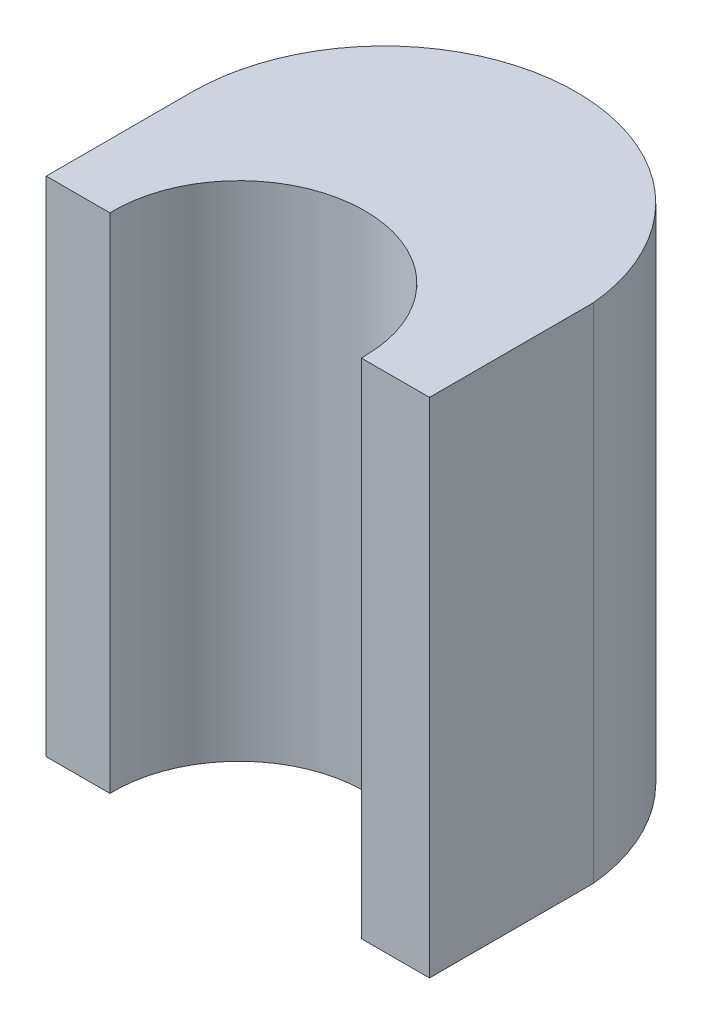
ISO-10303-21;
HEADER;
FILE_DESCRIPTION(('STEP AP214'),'2;1');
FILE_NAME('part.step','',(''),(''),'','','');
FILE_SCHEMA(('AUTOMOTIVE_DESIGN { 1 0 10303 214 1 1 1 1 }'));
ENDSEC;
DATA;
#1=APPLICATION_CONTEXT('core data for automotive mechanical design processes');
#2=APPLICATION_PROTOCOL_DEFINITION('international standard','automotive_design',2000,#1);
#3=PRODUCT_CONTEXT('',#1,'mechanical');
#4=PRODUCT('Part','Part','',(#3));
#5=PRODUCT_RELATED_PRODUCT_CATEGORY('part','',(#4));
#6=PRODUCT_DEFINITION_FORMATION('','',#4);
#7=PRODUCT_DEFINITION_CONTEXT('part definition',#1,'design');
#8=PRODUCT_DEFINITION('design','',#6,#7);
#9=PRODUCT_DEFINITION_SHAPE('','',#8);
#10=(LENGTH_UNIT() NAMED_UNIT(*) SI_UNIT(.MILLI.,.METRE.));
#11=(NAMED_UNIT(*) PLANE_ANGLE_UNIT() SI_UNIT($,.RADIAN.));
#12=(NAMED_UNIT(*) SI_UNIT($,.STERADIAN.) SOLID_ANGLE_UNIT());
#13=UNCERTAINTY_MEASURE_WITH_UNIT(LENGTH_MEASURE(1.E-05),#10,'distance_accuracy_value','');
#14=(GEOMETRIC_REPRESENTATION_CONTEXT(3) GLOBAL_UNCERTAINTY_ASSIGNED_CONTEXT((#13)) GLOBAL_UNIT_ASSIGNED_CONTEXT((#10,
#11,#12)) REPRESENTATION_CONTEXT('',''));
#15=CARTESIAN_POINT('',(0.,0.,0.));
#16=DIRECTION('',(0.,0.,1.));
#17=DIRECTION('',(1.,0.,0.));
#18=AXIS2_PLACEMENT_3D('',#15,#16,#17);
#19=CARTESIAN_POINT('',(1.26536763995208,2.87183105039429,15.5890947887312));
#20=DIRECTION('',(0.,1.,0.));
#21=DIRECTION('',(0.,0.,-1.));
#22=AXIS2_PLACEMENT_3D('',#19,#20,#21);
#23=PLANE('',#22);
#24=CARTESIAN_POINT('',(-5.17353236004811,2.87183105039429,24.4684287104753));
#25=DIRECTION('',(0.,1.,0.));
#26=DIRECTION('',(0.999103542626609,0.,0.0423333333315546));
#27=AXIS2_PLACEMENT_3D('',#24,#25,#26);
#28=CIRCLE('',#27,0.299999999999991);
#29=CARTESIAN_POINT('',(-4.87353411611542,2.87183105039429,24.4674022421439));
#30=VERTEX_POINT('',#29);
#31=CARTESIAN_POINT('',(-5.47340814412208,2.87183105039429,24.477060866987));
#32=VERTEX_POINT('',#31);
#33=EDGE_CURVE('E61',#30,#32,#28,.T.);
#34=ORIENTED_EDGE('',*,*,#33,.F.);
#35=CARTESIAN_POINT('',(-5.17269977573417,2.87183105039429,24.489760866987));
#36=DIRECTION('',(0.,1.,0.));
#37=DIRECTION('',(0.,0.,-1.));
#38=AXIS2_PLACEMENT_3D('',#35,#36,#37);
#39=CIRCLE('',#38,0.299999999999994);
#40=CARTESIAN_POINT('',(-4.87296871294621,2.87183105039429,24.4770608669871));
#41=VERTEX_POINT('',#40);
#42=EDGE_CURVE('E70',#41,#30,#39,.T.);
#43=ORIENTED_EDGE('',*,*,#42,.F.);
#44=DIRECTION('',(1.,0.,2.19014998791785E-13));
#45=VECTOR('',#44,1.);
#46=CARTESIAN_POINT('',(-4.8729687129462,2.87183105039429,24.4770608669871));
#47=LINE('',#46,#45);
#48=CARTESIAN_POINT('',(-4.71059082961791,2.87183105039429,24.4770608669871));
#49=VERTEX_POINT('',#48);
#50=EDGE_CURVE('E27',#41,#49,#47,.T.);
#51=ORIENTED_EDGE('',*,*,#50,.T.);
#52=DIRECTION('',(-2.31603663807447E-12,0.,1.));
#53=VECTOR('',#52,1.);
#54=CARTESIAN_POINT('',(-4.710590829617,2.87183105039429,24.0858628882505));
#55=LINE('',#54,#53);
#56=CARTESIAN_POINT('',(-4.710590829617,2.87183105039429,24.0858628882505));
#57=VERTEX_POINT('',#56);
#58=EDGE_CURVE('E11',#57,#49,#55,.T.);
#59=ORIENTED_EDGE('',*,*,#58,.F.);
#60=CARTESIAN_POINT('',(-5.16688422460084,2.87183105039429,24.1289507885883));
#61=DIRECTION('',(0.,1.,0.));
#62=DIRECTION('',(0.995571061700838,0.,-0.0940120263788917));
#63=AXIS2_PLACEMENT_3D('',#60,#61,#62);
#64=CIRCLE('',#63,0.458323280514298);
#65=CARTESIAN_POINT('',(-5.62520750511512,2.87183105039429,24.1289507885881));
#66=VERTEX_POINT('',#65);
#67=EDGE_CURVE('E118',#57,#66,#64,.T.);
#68=ORIENTED_EDGE('',*,*,#67,.T.);
#69=DIRECTION('',(-7.39892430869169E-12,0.,-1.));
#70=VECTOR('',#69,1.);
#71=CARTESIAN_POINT('',(-5.62520750511255,2.87183105039429,24.4770608669869));
#72=LINE('',#71,#70);
#73=CARTESIAN_POINT('',(-5.62520750511255,2.87183105039429,24.4770608669869));
#74=VERTEX_POINT('',#73);
#75=EDGE_CURVE('E122',#74,#66,#72,.T.);
#76=ORIENTED_EDGE('',*,*,#75,.F.);
#77=DIRECTION('',(1.,0.,5.81579420434685E-13));
#78=VECTOR('',#77,1.);
#79=CARTESIAN_POINT('',(-5.62520750511255,2.87183105039429,24.4770608669869));
#80=LINE('',#79,#78);
#81=EDGE_CURVE('E83',#74,#32,#80,.T.);
#82=ORIENTED_EDGE('',*,*,#81,.T.);
#83=EDGE_LOOP('',(#34,#43,#51,#59,#68,#76,#82));
#84=FACE_BOUND('',#83,.T.);
#85=ADVANCED_FACE('F17',(#84),#23,.T.);
#86=CARTESIAN_POINT('',(-4.710590829617,2.87183105039429,24.0858628882505));
#87=DIRECTION('',(1.,0.,2.31603663807447E-12));
#88=DIRECTION('',(-2.31603663807447E-12,0.,1.));
#89=AXIS2_PLACEMENT_3D('',#86,#87,#88);
#90=PLANE('',#89);
#91=DIRECTION('',(2.31603663807447E-12,0.,-1.));
#92=VECTOR('',#91,1.);
#93=CARTESIAN_POINT('',(-4.71059082960717,1.6718310055699,19.8374788384839));
#94=LINE('',#93,#92);
#95=CARTESIAN_POINT('',(-4.7105908296179,1.6718310055699,24.4770608669871));
#96=VERTEX_POINT('',#95);
#97=CARTESIAN_POINT('',(-4.710590829617,1.6718310055699,24.0858628882505));
#98=VERTEX_POINT('',#97);
#99=EDGE_CURVE('E135',#96,#98,#94,.T.);
#100=ORIENTED_EDGE('',*,*,#99,.T.);
#101=DIRECTION('',(0.,-1.,0.));
#102=VECTOR('',#101,1.);
#103=CARTESIAN_POINT('',(-4.710590829617,2.87183105039429,24.0858628882505));
#104=LINE('',#103,#102);
#105=EDGE_CURVE('E113',#57,#98,#104,.T.);
#106=ORIENTED_EDGE('',*,*,#105,.F.);
#107=ORIENTED_EDGE('',*,*,#58,.T.);
#108=DIRECTION('',(0.,-1.,0.));
#109=VECTOR('',#108,1.);
#110=CARTESIAN_POINT('',(-4.71059082961791,2.87183105039429,24.4770608669871));
#111=LINE('',#110,#109);
#112=EDGE_CURVE('E80',#49,#96,#111,.T.);
#113=ORIENTED_EDGE('',*,*,#112,.T.);
#114=EDGE_LOOP('',(#100,#106,#107,#113));
#115=FACE_BOUND('',#114,.T.);
#116=ADVANCED_FACE('F194',(#115),#90,.T.);
#117=CARTESIAN_POINT('',(-4.71059082961791,2.87183105039429,24.4770608669871));
#118=DIRECTION('',(-2.19014998791785E-13,0.,1.));
#119=DIRECTION('',(1.,0.,2.19014998791785E-13));
#120=AXIS2_PLACEMENT_3D('',#117,#118,#119);
#121=PLANE('',#120);
#122=DIRECTION('',(1.,0.,2.19014998791785E-13));
#123=VECTOR('',#122,1.);
#124=CARTESIAN_POINT('',(-1.72261159483388,1.6718310055699,24.4770608669878));
#125=LINE('',#124,#123);
#126=CARTESIAN_POINT('',(-4.87296871294621,1.6718310055699,24.4770608669871));
#127=VERTEX_POINT('',#126);
#128=EDGE_CURVE('E130',#127,#96,#125,.T.);
#129=ORIENTED_EDGE('',*,*,#128,.T.);
#130=ORIENTED_EDGE('',*,*,#112,.F.);
#131=ORIENTED_EDGE('',*,*,#50,.F.);
#132=DIRECTION('',(0.,-1.,0.));
#133=VECTOR('',#132,1.);
#134=CARTESIAN_POINT('',(-4.87296871294621,2.87183105039429,24.4770608669871));
#135=LINE('',#134,#133);
#136=EDGE_CURVE('E77',#41,#127,#135,.T.);
#137=ORIENTED_EDGE('',*,*,#136,.T.);
#138=EDGE_LOOP('',(#129,#130,#131,#137));
#139=FACE_BOUND('',#138,.T.);
#140=ADVANCED_FACE('F19',(#139),#121,.T.);
#141=CARTESIAN_POINT('',(-5.17269977573417,2.87183105039429,24.489760866987));
#142=DIRECTION('',(0.,-1.,0.));
#143=DIRECTION('',(0.,0.,-1.));
#144=AXIS2_PLACEMENT_3D('',#141,#142,#143);
#145=CYLINDRICAL_SURFACE('',#144,0.299999999999994);
#146=CARTESIAN_POINT('',(-5.17269977573417,1.6718310055699,24.489760866987));
#147=DIRECTION('',(0.,-1.,0.));
#148=DIRECTION('',(0.,0.,-1.));
#149=AXIS2_PLACEMENT_3D('',#146,#147,#148);
#150=CIRCLE('',#149,0.299999999999994);
#151=CARTESIAN_POINT('',(-4.87353411611541,1.6718310055699,24.4674022421439));
#152=VERTEX_POINT('',#151);
#153=EDGE_CURVE('E126',#152,#127,#150,.T.);
#154=ORIENTED_EDGE('',*,*,#153,.T.);
#155=ORIENTED_EDGE('',*,*,#136,.F.);
#156=ORIENTED_EDGE('',*,*,#42,.T.);
#157=DIRECTION('',(0.,-1.,0.));
#158=VECTOR('',#157,1.);
#159=CARTESIAN_POINT('',(-4.87353411611542,2.87183105039429,24.4674022421439));
#160=LINE('',#159,#158);
#161=EDGE_CURVE('E74',#30,#152,#160,.T.);
#162=ORIENTED_EDGE('',*,*,#161,.T.);
#163=EDGE_LOOP('',(#154,#155,#156,#162));
#164=FACE_BOUND('',#163,.T.);
#165=ADVANCED_FACE('F72',(#164),#145,.F.);
#166=CARTESIAN_POINT('',(-5.17353236004811,2.87183105039429,24.4684287104753));
#167=DIRECTION('',(0.,-1.,0.));
#168=DIRECTION('',(-0.0160990018908676,0.,-0.999870402671325));
#169=AXIS2_PLACEMENT_3D('',#166,#167,#168);
#170=CYLINDRICAL_SURFACE('',#169,0.299999999999991);
#171=CARTESIAN_POINT('',(-5.17353236004811,1.6718310055699,24.4684287104753));
#172=DIRECTION('',(0.,-1.,0.));
#173=DIRECTION('',(0.999103542626609,0.,0.0423333333315546));
#174=AXIS2_PLACEMENT_3D('',#171,#172,#173);
#175=CIRCLE('',#174,0.299999999999991);
#176=CARTESIAN_POINT('',(-5.47340814412207,1.6718310055699,24.477060866987));
#177=VERTEX_POINT('',#176);
#178=EDGE_CURVE('E90',#177,#152,#175,.T.);
#179=ORIENTED_EDGE('',*,*,#178,.T.);
#180=ORIENTED_EDGE('',*,*,#161,.F.);
#181=ORIENTED_EDGE('',*,*,#33,.T.);
#182=DIRECTION('',(0.,-1.,0.));
#183=VECTOR('',#182,1.);
#184=CARTESIAN_POINT('',(-5.47340814412208,2.87183105039429,24.477060866987));
#185=LINE('',#184,#183);
#186=EDGE_CURVE('E97',#32,#177,#185,.T.);
#187=ORIENTED_EDGE('',*,*,#186,.T.);
#188=EDGE_LOOP('',(#179,#180,#181,#187));
#189=FACE_BOUND('',#188,.T.);
#190=ADVANCED_FACE('F88',(#189),#170,.F.);
#191=CARTESIAN_POINT('',(-5.47340814412208,2.87183105039429,24.477060866987));
#192=DIRECTION('',(-5.81579420434685E-13,0.,1.));
#193=DIRECTION('',(1.,0.,5.81579420434685E-13));
#194=AXIS2_PLACEMENT_3D('',#191,#192,#193);
#195=PLANE('',#194);
#196=DIRECTION('',(1.,0.,5.81579420434685E-13));
#197=VECTOR('',#196,1.);
#198=CARTESIAN_POINT('',(-2.10402025208758,1.6718310055699,24.477060866989));
#199=LINE('',#198,#197);
#200=CARTESIAN_POINT('',(-5.62520750511254,1.6718310055699,24.4770608669869));
#201=VERTEX_POINT('',#200);
#202=EDGE_CURVE('E146',#201,#177,#199,.T.);
#203=ORIENTED_EDGE('',*,*,#202,.T.);
#204=ORIENTED_EDGE('',*,*,#186,.F.);
#205=ORIENTED_EDGE('',*,*,#81,.F.);
#206=DIRECTION('',(0.,-1.,0.));
#207=VECTOR('',#206,1.);
#208=CARTESIAN_POINT('',(-5.62520750511255,2.87183105039429,24.4770608669869));
#209=LINE('',#208,#207);
#210=EDGE_CURVE('E117',#74,#201,#209,.T.);
#211=ORIENTED_EDGE('',*,*,#210,.T.);
#212=EDGE_LOOP('',(#203,#204,#205,#211));
#213=FACE_BOUND('',#212,.T.);
#214=ADVANCED_FACE('F212',(#213),#195,.T.);
#215=CARTESIAN_POINT('',(-5.62520750511255,2.87183105039429,24.4770608669869));
#216=DIRECTION('',(-1.,0.,7.39892430869169E-12));
#217=DIRECTION('',(0.,1.,0.));
#218=AXIS2_PLACEMENT_3D('',#215,#216,#217);
#219=PLANE('',#218);
#220=DIRECTION('',(7.39892430869169E-12,0.,1.));
#221=VECTOR('',#220,1.);
#222=CARTESIAN_POINT('',(-5.62520750514543,1.6718310055699,20.0330778278845));
#223=LINE('',#222,#221);
#224=CARTESIAN_POINT('',(-5.62520750511511,1.6718310055699,24.1289507885881));
#225=VERTEX_POINT('',#224);
#226=EDGE_CURVE('E142',#225,#201,#223,.T.);
#227=ORIENTED_EDGE('',*,*,#226,.T.);
#228=ORIENTED_EDGE('',*,*,#210,.F.);
#229=ORIENTED_EDGE('',*,*,#75,.T.);
#230=DIRECTION('',(0.,-1.,0.));
#231=VECTOR('',#230,1.);
#232=CARTESIAN_POINT('',(-5.62520750511512,2.87183105039429,24.1289507885881));
#233=LINE('',#232,#231);
#234=EDGE_CURVE('E123',#66,#225,#233,.T.);
#235=ORIENTED_EDGE('',*,*,#234,.T.);
#236=EDGE_LOOP('',(#227,#228,#229,#235));
#237=FACE_BOUND('',#236,.T.);
#238=ADVANCED_FACE('F176',(#237),#219,.T.);
#239=CARTESIAN_POINT('',(-5.16688422460084,2.87183105039429,24.1289507885883));
#240=DIRECTION('',(0.,-1.,0.));
#241=DIRECTION('',(0.995571061700838,0.,-0.0940120263788917));
#242=AXIS2_PLACEMENT_3D('',#239,#240,#241);
#243=CYLINDRICAL_SURFACE('',#242,0.458323280514298);
#244=CARTESIAN_POINT('',(-5.16688422460084,1.6718310055699,24.1289507885883));
#245=DIRECTION('',(0.,1.,0.));
#246=DIRECTION('',(0.995571061700838,0.,-0.0940120263788917));
#247=AXIS2_PLACEMENT_3D('',#244,#245,#246);
#248=CIRCLE('',#247,0.458323280514298);
#249=EDGE_CURVE('E138',#98,#225,#248,.T.);
#250=ORIENTED_EDGE('',*,*,#249,.T.);
#251=ORIENTED_EDGE('',*,*,#234,.F.);
#252=ORIENTED_EDGE('',*,*,#67,.F.);
#253=ORIENTED_EDGE('',*,*,#105,.T.);
#254=EDGE_LOOP('',(#250,#251,#252,#253));
#255=FACE_BOUND('',#254,.T.);
#256=ADVANCED_FACE('F164',(#255),#243,.T.);
#257=CARTESIAN_POINT('',(1.26536763995209,1.6718310055699,15.5890947887312));
#258=DIRECTION('',(0.,1.,0.));
#259=DIRECTION('',(0.,0.,-1.));
#260=AXIS2_PLACEMENT_3D('',#257,#258,#259);
#261=PLANE('',#260);
#262=ORIENTED_EDGE('',*,*,#178,.F.);
#263=ORIENTED_EDGE('',*,*,#202,.F.);
#264=ORIENTED_EDGE('',*,*,#226,.F.);
#265=ORIENTED_EDGE('',*,*,#249,.F.);
#266=ORIENTED_EDGE('',*,*,#99,.F.);
#267=ORIENTED_EDGE('',*,*,#128,.F.);
#268=ORIENTED_EDGE('',*,*,#153,.F.);
#269=EDGE_LOOP('',(#262,#263,#264,#265,#266,#267,#268));
#270=FACE_BOUND('',#269,.T.);
#271=ADVANCED_FACE('F173',(#270),#261,.F.);
#272=CLOSED_SHELL('',(#85,#116,#140,#165,#190,#214,#238,#256,#271));
#273=MANIFOLD_SOLID_BREP('B1',#272);
#274=ADVANCED_BREP_SHAPE_REPRESENTATION('',(#18,#273),#14);
#275=SHAPE_DEFINITION_REPRESENTATION(#9,#274);
ENDSEC;
END-ISO-10303-21;
